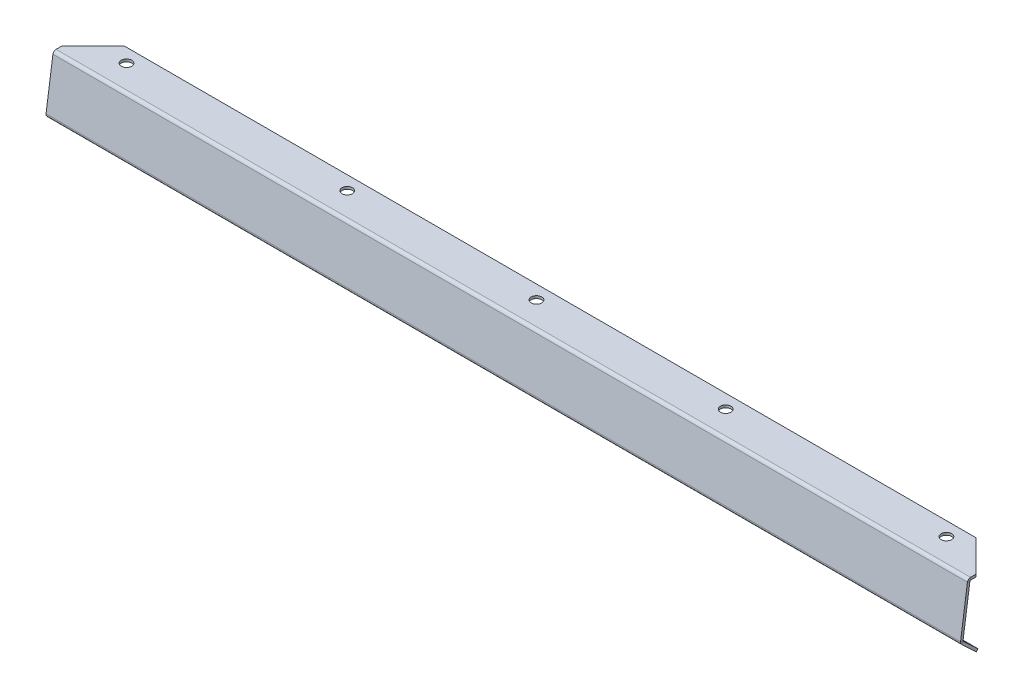
ISO-10303-21;
HEADER;
FILE_DESCRIPTION(('STEP AP214'),'2;1');
FILE_NAME('part.step','',(''),(''),'','','');
FILE_SCHEMA(('AUTOMOTIVE_DESIGN { 1 0 10303 214 1 1 1 1 }'));
ENDSEC;
DATA;
#1=APPLICATION_CONTEXT('core data for automotive mechanical design processes');
#2=APPLICATION_PROTOCOL_DEFINITION('international standard','automotive_design',2000,#1);
#3=PRODUCT_CONTEXT('',#1,'mechanical');
#4=PRODUCT('Part','Part','',(#3));
#5=PRODUCT_RELATED_PRODUCT_CATEGORY('part','',(#4));
#6=PRODUCT_DEFINITION_FORMATION('','',#4);
#7=PRODUCT_DEFINITION_CONTEXT('part definition',#1,'design');
#8=PRODUCT_DEFINITION('design','',#6,#7);
#9=PRODUCT_DEFINITION_SHAPE('','',#8);
#10=(LENGTH_UNIT() NAMED_UNIT(*) SI_UNIT(.MILLI.,.METRE.));
#11=(NAMED_UNIT(*) PLANE_ANGLE_UNIT() SI_UNIT($,.RADIAN.));
#12=(NAMED_UNIT(*) SI_UNIT($,.STERADIAN.) SOLID_ANGLE_UNIT());
#13=UNCERTAINTY_MEASURE_WITH_UNIT(LENGTH_MEASURE(1.E-05),#10,'distance_accuracy_value','');
#14=(GEOMETRIC_REPRESENTATION_CONTEXT(3) GLOBAL_UNCERTAINTY_ASSIGNED_CONTEXT((#13)) GLOBAL_UNIT_ASSIGNED_CONTEXT((#10,
#11,#12)) REPRESENTATION_CONTEXT('',''));
#15=CARTESIAN_POINT('',(0.,0.,0.));
#16=DIRECTION('',(0.,0.,1.));
#17=DIRECTION('',(1.,0.,0.));
#18=AXIS2_PLACEMENT_3D('',#15,#16,#17);
#19=CARTESIAN_POINT('',(-184.15,0.,10.4394001306232));
#20=DIRECTION('',(0.,1.,0.));
#21=DIRECTION('',(0.,0.,1.));
#22=AXIS2_PLACEMENT_3D('',#19,#20,#21);
#23=PLANE('',#22);
#24=CARTESIAN_POINT('',(-76.2,0.,0.));
#25=DIRECTION('',(0.,1.,0.));
#26=DIRECTION('',(0.,0.,-1.));
#27=AXIS2_PLACEMENT_3D('',#24,#25,#26);
#28=CIRCLE('',#27,2.1082);
#29=CARTESIAN_POINT('',(-76.2,0.,-2.1082));
#30=VERTEX_POINT('',#29);
#31=EDGE_CURVE('E248',#30,#30,#28,.T.);
#32=ORIENTED_EDGE('',*,*,#31,.F.);
#33=EDGE_LOOP('',(#32));
#34=FACE_BOUND('',#33,.T.);
#35=CARTESIAN_POINT('',(-165.1,0.,0.));
#36=DIRECTION('',(0.,1.,0.));
#37=DIRECTION('',(0.,0.,-1.));
#38=AXIS2_PLACEMENT_3D('',#35,#36,#37);
#39=CIRCLE('',#38,2.10820000000002);
#40=CARTESIAN_POINT('',(-165.1,0.,-2.10820000000002));
#41=VERTEX_POINT('',#40);
#42=EDGE_CURVE('E238',#41,#41,#39,.T.);
#43=ORIENTED_EDGE('',*,*,#42,.F.);
#44=EDGE_LOOP('',(#43));
#45=FACE_BOUND('',#44,.T.);
#46=CARTESIAN_POINT('',(165.1,0.,0.));
#47=DIRECTION('',(0.,1.,0.));
#48=DIRECTION('',(0.,0.,1.));
#49=AXIS2_PLACEMENT_3D('',#46,#47,#48);
#50=CIRCLE('',#49,2.10820000000002);
#51=CARTESIAN_POINT('',(165.1,0.,2.10820000000002));
#52=VERTEX_POINT('',#51);
#53=EDGE_CURVE('E235',#52,#52,#50,.T.);
#54=ORIENTED_EDGE('',*,*,#53,.F.);
#55=EDGE_LOOP('',(#54));
#56=FACE_BOUND('',#55,.T.);
#57=CARTESIAN_POINT('',(76.2,0.,0.));
#58=DIRECTION('',(0.,1.,0.));
#59=DIRECTION('',(0.,0.,1.));
#60=AXIS2_PLACEMENT_3D('',#57,#58,#59);
#61=CIRCLE('',#60,2.1082);
#62=CARTESIAN_POINT('',(76.2,0.,2.1082));
#63=VERTEX_POINT('',#62);
#64=EDGE_CURVE('E232',#63,#63,#61,.T.);
#65=ORIENTED_EDGE('',*,*,#64,.F.);
#66=EDGE_LOOP('',(#65));
#67=FACE_BOUND('',#66,.T.);
#68=CARTESIAN_POINT('',(0.,0.,0.));
#69=DIRECTION('',(0.,1.,0.));
#70=DIRECTION('',(0.,0.,1.));
#71=AXIS2_PLACEMENT_3D('',#68,#69,#70);
#72=CIRCLE('',#71,2.1082);
#73=CARTESIAN_POINT('',(0.,0.,2.1082));
#74=VERTEX_POINT('',#73);
#75=EDGE_CURVE('E228',#74,#74,#72,.T.);
#76=ORIENTED_EDGE('',*,*,#75,.F.);
#77=EDGE_LOOP('',(#76));
#78=FACE_BOUND('',#77,.T.);
#79=DIRECTION('',(0.,0.,1.));
#80=VECTOR('',#79,1.);
#81=CARTESIAN_POINT('',(184.15,0.,10.4394001306232));
#82=LINE('',#81,#80);
#83=CARTESIAN_POINT('',(184.15,0.,7.13740013062336));
#84=VERTEX_POINT('',#83);
#85=CARTESIAN_POINT('',(184.15,0.,9.33821065404479));
#86=VERTEX_POINT('',#85);
#87=EDGE_CURVE('E159',#84,#86,#82,.T.);
#88=ORIENTED_EDGE('',*,*,#87,.F.);
#89=DIRECTION('',(0.707106781186544,0.,0.707106781186551));
#90=VECTOR('',#89,1.);
#91=CARTESIAN_POINT('',(170.559937335768,0.,-6.45266253360896));
#92=LINE('',#91,#90);
#93=CARTESIAN_POINT('',(171.45,0.,-5.5625998693768));
#94=VERTEX_POINT('',#93);
#95=EDGE_CURVE('E54',#94,#84,#92,.T.);
#96=ORIENTED_EDGE('',*,*,#95,.F.);
#97=DIRECTION('',(1.,0.,0.));
#98=VECTOR('',#97,1.);
#99=CARTESIAN_POINT('',(-184.15,0.,-5.56259986937679));
#100=LINE('',#99,#98);
#101=CARTESIAN_POINT('',(-171.45,0.,-5.56259986937679));
#102=VERTEX_POINT('',#101);
#103=EDGE_CURVE('E191',#102,#94,#100,.T.);
#104=ORIENTED_EDGE('',*,*,#103,.F.);
#105=DIRECTION('',(0.707106781186544,0.,-0.707106781186551));
#106=VECTOR('',#105,1.);
#107=CARTESIAN_POINT('',(-170.559937335768,0.,-6.45266253360896));
#108=LINE('',#107,#106);
#109=CARTESIAN_POINT('',(-184.15,0.,7.13740013062334));
#110=VERTEX_POINT('',#109);
#111=EDGE_CURVE('E436',#110,#102,#108,.T.);
#112=ORIENTED_EDGE('',*,*,#111,.F.);
#113=DIRECTION('',(0.,0.,1.));
#114=VECTOR('',#113,1.);
#115=CARTESIAN_POINT('',(-184.15,0.,10.4394001306232));
#116=LINE('',#115,#114);
#117=CARTESIAN_POINT('',(-184.15,0.,9.33821065404479));
#118=VERTEX_POINT('',#117);
#119=EDGE_CURVE('E273',#110,#118,#116,.T.);
#120=ORIENTED_EDGE('',*,*,#119,.T.);
#121=DIRECTION('',(1.,0.,0.));
#122=VECTOR('',#121,1.);
#123=CARTESIAN_POINT('',(-184.15,0.,9.33821065404479));
#124=LINE('',#123,#122);
#125=EDGE_CURVE('E188',#118,#86,#124,.T.);
#126=ORIENTED_EDGE('',*,*,#125,.T.);
#127=EDGE_LOOP('',(#88,#96,#104,#112,#120,#126));
#128=FACE_BOUND('',#127,.T.);
#129=ADVANCED_FACE('F37',(#34,#45,#56,#67,#78,#128),#23,.T.);
#130=CARTESIAN_POINT('',(-184.15,0.,-5.56259986937679));
#131=DIRECTION('',(0.,0.,1.));
#132=DIRECTION('',(1.,0.,0.));
#133=AXIS2_PLACEMENT_3D('',#130,#131,#132);
#134=PLANE('',#133);
#135=DIRECTION('',(0.,1.,0.));
#136=VECTOR('',#135,1.);
#137=CARTESIAN_POINT('',(171.45,0.,-5.5625998693768));
#138=LINE('',#137,#136);
#139=CARTESIAN_POINT('',(171.45,-1.016,-5.5625998693768));
#140=VERTEX_POINT('',#139);
#141=EDGE_CURVE('E144',#94,#140,#138,.F.);
#142=ORIENTED_EDGE('',*,*,#141,.T.);
#143=DIRECTION('',(1.,0.,0.));
#144=VECTOR('',#143,1.);
#145=CARTESIAN_POINT('',(-184.15,-1.016,-5.56259986937679));
#146=LINE('',#145,#144);
#147=CARTESIAN_POINT('',(-171.45,-1.016,-5.56259986937679));
#148=VERTEX_POINT('',#147);
#149=EDGE_CURVE('E153',#148,#140,#146,.T.);
#150=ORIENTED_EDGE('',*,*,#149,.F.);
#151=DIRECTION('',(0.,-1.,0.));
#152=VECTOR('',#151,1.);
#153=CARTESIAN_POINT('',(-171.45,-1.016,-5.56259986937679));
#154=LINE('',#153,#152);
#155=EDGE_CURVE('E441',#148,#102,#154,.F.);
#156=ORIENTED_EDGE('',*,*,#155,.T.);
#157=ORIENTED_EDGE('',*,*,#103,.T.);
#158=EDGE_LOOP('',(#142,#150,#156,#157));
#159=FACE_BOUND('',#158,.T.);
#160=ADVANCED_FACE('F363',(#159),#134,.F.);
#161=CARTESIAN_POINT('',(-184.15,-1.016,10.4394001306232));
#162=DIRECTION('',(0.,1.,0.));
#163=DIRECTION('',(0.,0.,1.));
#164=AXIS2_PLACEMENT_3D('',#161,#162,#163);
#165=PLANE('',#164);
#166=CARTESIAN_POINT('',(-76.2,-1.016,0.));
#167=DIRECTION('',(0.,1.,0.));
#168=DIRECTION('',(0.,0.,1.));
#169=AXIS2_PLACEMENT_3D('',#166,#167,#168);
#170=CIRCLE('',#169,2.1082);
#171=CARTESIAN_POINT('',(-76.2,-1.016,2.1082));
#172=VERTEX_POINT('',#171);
#173=EDGE_CURVE('E41',#172,#172,#170,.T.);
#174=ORIENTED_EDGE('',*,*,#173,.T.);
#175=EDGE_LOOP('',(#174));
#176=FACE_BOUND('',#175,.T.);
#177=CARTESIAN_POINT('',(-165.1,-1.016,0.));
#178=DIRECTION('',(0.,1.,0.));
#179=DIRECTION('',(0.,0.,1.));
#180=AXIS2_PLACEMENT_3D('',#177,#178,#179);
#181=CIRCLE('',#180,2.10820000000002);
#182=CARTESIAN_POINT('',(-165.1,-1.016,2.10820000000002));
#183=VERTEX_POINT('',#182);
#184=EDGE_CURVE('E236',#183,#183,#181,.T.);
#185=ORIENTED_EDGE('',*,*,#184,.T.);
#186=EDGE_LOOP('',(#185));
#187=FACE_BOUND('',#186,.T.);
#188=CARTESIAN_POINT('',(165.1,-1.016,0.));
#189=DIRECTION('',(0.,1.,0.));
#190=DIRECTION('',(0.,0.,1.));
#191=AXIS2_PLACEMENT_3D('',#188,#189,#190);
#192=CIRCLE('',#191,2.10820000000002);
#193=CARTESIAN_POINT('',(165.1,-1.016,2.10820000000002));
#194=VERTEX_POINT('',#193);
#195=EDGE_CURVE('E233',#194,#194,#192,.T.);
#196=ORIENTED_EDGE('',*,*,#195,.T.);
#197=EDGE_LOOP('',(#196));
#198=FACE_BOUND('',#197,.T.);
#199=CARTESIAN_POINT('',(76.2,-1.016,0.));
#200=DIRECTION('',(0.,1.,0.));
#201=DIRECTION('',(0.,0.,1.));
#202=AXIS2_PLACEMENT_3D('',#199,#200,#201);
#203=CIRCLE('',#202,2.1082);
#204=CARTESIAN_POINT('',(76.2,-1.016,2.1082));
#205=VERTEX_POINT('',#204);
#206=EDGE_CURVE('E229',#205,#205,#203,.T.);
#207=ORIENTED_EDGE('',*,*,#206,.T.);
#208=EDGE_LOOP('',(#207));
#209=FACE_BOUND('',#208,.T.);
#210=CARTESIAN_POINT('',(0.,-1.016,0.));
#211=DIRECTION('',(0.,1.,0.));
#212=DIRECTION('',(0.,0.,1.));
#213=AXIS2_PLACEMENT_3D('',#210,#211,#212);
#214=CIRCLE('',#213,2.1082);
#215=CARTESIAN_POINT('',(0.,-1.016,2.1082));
#216=VERTEX_POINT('',#215);
#217=EDGE_CURVE('E224',#216,#216,#214,.T.);
#218=ORIENTED_EDGE('',*,*,#217,.T.);
#219=EDGE_LOOP('',(#218));
#220=FACE_BOUND('',#219,.T.);
#221=DIRECTION('',(0.707106781186544,0.,0.707106781186551));
#222=VECTOR('',#221,1.);
#223=CARTESIAN_POINT('',(170.559937335768,-1.016,-6.45266253360896));
#224=LINE('',#223,#222);
#225=CARTESIAN_POINT('',(184.15,-1.016,7.13740013062335));
#226=VERTEX_POINT('',#225);
#227=EDGE_CURVE('E139',#140,#226,#224,.T.);
#228=ORIENTED_EDGE('',*,*,#227,.T.);
#229=DIRECTION('',(0.,0.,-1.));
#230=VECTOR('',#229,1.);
#231=CARTESIAN_POINT('',(184.15,-1.016,10.4394001306232));
#232=LINE('',#231,#230);
#233=CARTESIAN_POINT('',(184.15,-1.016,9.33821065404479));
#234=VERTEX_POINT('',#233);
#235=EDGE_CURVE('E150',#226,#234,#232,.F.);
#236=ORIENTED_EDGE('',*,*,#235,.T.);
#237=DIRECTION('',(1.,0.,0.));
#238=VECTOR('',#237,1.);
#239=CARTESIAN_POINT('',(-184.15,-1.016,9.33821065404479));
#240=LINE('',#239,#238);
#241=CARTESIAN_POINT('',(-184.15,-1.016,9.33821065404479));
#242=VERTEX_POINT('',#241);
#243=EDGE_CURVE('E195',#242,#234,#240,.T.);
#244=ORIENTED_EDGE('',*,*,#243,.F.);
#245=DIRECTION('',(0.,0.,-1.));
#246=VECTOR('',#245,1.);
#247=CARTESIAN_POINT('',(-184.15,-1.016,10.4394001306232));
#248=LINE('',#247,#246);
#249=CARTESIAN_POINT('',(-184.15,-1.016,7.13740013062334));
#250=VERTEX_POINT('',#249);
#251=EDGE_CURVE('E271',#250,#242,#248,.F.);
#252=ORIENTED_EDGE('',*,*,#251,.F.);
#253=DIRECTION('',(0.707106781186544,0.,-0.707106781186551));
#254=VECTOR('',#253,1.);
#255=CARTESIAN_POINT('',(-170.559937335768,-1.016,-6.45266253360896));
#256=LINE('',#255,#254);
#257=EDGE_CURVE('E62',#250,#148,#256,.T.);
#258=ORIENTED_EDGE('',*,*,#257,.T.);
#259=ORIENTED_EDGE('',*,*,#149,.T.);
#260=EDGE_LOOP('',(#228,#236,#244,#252,#258,#259));
#261=FACE_BOUND('',#260,.T.);
#262=ADVANCED_FACE('F148',(#176,#187,#198,#209,#220,#261),#165,.F.);
#263=CARTESIAN_POINT('',(184.15,-1.23401666822171,9.58964891651519));
#264=DIRECTION('',(1.,0.,0.));
#265=DIRECTION('',(0.,0.,-1.));
#266=AXIS2_PLACEMENT_3D('',#263,#264,#265);
#267=PLANE('',#266);
#268=ORIENTED_EDGE('',*,*,#235,.F.);
#269=DIRECTION('',(0.,1.,0.));
#270=VECTOR('',#269,1.);
#271=CARTESIAN_POINT('',(184.15,0.,7.13740013062335));
#272=LINE('',#271,#270);
#273=EDGE_CURVE('E136',#84,#226,#272,.F.);
#274=ORIENTED_EDGE('',*,*,#273,.F.);
#275=ORIENTED_EDGE('',*,*,#87,.T.);
#276=DIRECTION('',(0.,-1.,0.));
#277=VECTOR('',#276,1.);
#278=CARTESIAN_POINT('',(184.15,0.,9.33821065404479));
#279=LINE('',#278,#277);
#280=EDGE_CURVE('E157',#86,#234,#279,.T.);
#281=ORIENTED_EDGE('',*,*,#280,.T.);
#282=EDGE_LOOP('',(#268,#274,#275,#281));
#283=FACE_BOUND('',#282,.T.);
#284=ADVANCED_FACE('F155',(#283),#267,.T.);
#285=CARTESIAN_POINT('',(-184.15,-20.6462783329546,12.1111500031837));
#286=DIRECTION('',(1.,0.,0.));
#287=DIRECTION('',(0.,0.,-1.));
#288=AXIS2_PLACEMENT_3D('',#285,#286,#287);
#289=PLANE('',#288);
#290=DIRECTION('',(0.,-1.,0.));
#291=VECTOR('',#290,1.);
#292=CARTESIAN_POINT('',(-184.15,-1.016,7.13740013062334));
#293=LINE('',#292,#291);
#294=EDGE_CURVE('E438',#250,#110,#293,.F.);
#295=ORIENTED_EDGE('',*,*,#294,.F.);
#296=ORIENTED_EDGE('',*,*,#251,.T.);
#297=DIRECTION('',(0.,1.,0.));
#298=VECTOR('',#297,1.);
#299=CARTESIAN_POINT('',(-184.15,-1.016,9.33821065404479));
#300=LINE('',#299,#298);
#301=EDGE_CURVE('E46',#242,#118,#300,.T.);
#302=ORIENTED_EDGE('',*,*,#301,.T.);
#303=ORIENTED_EDGE('',*,*,#119,.F.);
#304=EDGE_LOOP('',(#295,#296,#302,#303));
#305=FACE_BOUND('',#304,.T.);
#306=ADVANCED_FACE('F399',(#305),#289,.F.);
#307=CARTESIAN_POINT('',(-184.15,-1.09008334110853,10.5954019663968));
#308=DIRECTION('',(-1.,0.,0.));
#309=DIRECTION('',(0.,0.,1.));
#310=AXIS2_PLACEMENT_3D('',#307,#308,#309);
#311=PLANE('',#310);
#312=DIRECTION('',(0.,-0.141666660544467,-0.989914419174798));
#313=VECTOR('',#312,1.);
#314=CARTESIAN_POINT('',(-184.15,-1.09008334110853,10.5954019663968));
#315=LINE('',#314,#313);
#316=CARTESIAN_POINT('',(-184.15,-1.09008334110853,10.5954019663968));
#317=VERTEX_POINT('',#316);
#318=CARTESIAN_POINT('',(-184.15,-1.23401666822171,9.58964891651519));
#319=VERTEX_POINT('',#318);
#320=EDGE_CURVE('E11',#317,#319,#315,.T.);
#321=ORIENTED_EDGE('',*,*,#320,.F.);
#322=CARTESIAN_POINT('',(-184.15,-1.27,9.33821065404479));
#323=DIRECTION('',(-1.,0.,0.));
#324=DIRECTION('',(0.,0.,1.));
#325=AXIS2_PLACEMENT_3D('',#322,#323,#324);
#326=CIRCLE('',#325,1.27);
#327=EDGE_CURVE('E275',#118,#317,#326,.F.);
#328=ORIENTED_EDGE('',*,*,#327,.F.);
#329=ORIENTED_EDGE('',*,*,#301,.F.);
#330=CARTESIAN_POINT('',(-184.15,-1.27,9.33821065404479));
#331=DIRECTION('',(1.,0.,0.));
#332=DIRECTION('',(0.,0.,-1.));
#333=AXIS2_PLACEMENT_3D('',#330,#331,#332);
#334=CIRCLE('',#333,0.254);
#335=EDGE_CURVE('E268',#242,#319,#334,.T.);
#336=ORIENTED_EDGE('',*,*,#335,.T.);
#337=EDGE_LOOP('',(#321,#328,#329,#336));
#338=FACE_BOUND('',#337,.T.);
#339=ADVANCED_FACE('F39',(#338),#311,.T.);
#340=CARTESIAN_POINT('',(-184.15,-1.016,9.33821065404479));
#341=DIRECTION('',(-1.,0.,0.));
#342=DIRECTION('',(0.,0.,1.));
#343=AXIS2_PLACEMENT_3D('',#340,#341,#342);
#344=PLANE('',#343);
#345=DIRECTION('',(0.,-0.989914419174799,0.141666660544467));
#346=VECTOR('',#345,1.);
#347=CARTESIAN_POINT('',(-184.15,0.,10.4394001306232));
#348=LINE('',#347,#346);
#349=CARTESIAN_POINT('',(-184.15,-20.4663616740631,13.3683413155357));
#350=VERTEX_POINT('',#349);
#351=EDGE_CURVE('E278',#317,#350,#348,.T.);
#352=ORIENTED_EDGE('',*,*,#351,.F.);
#353=ORIENTED_EDGE('',*,*,#320,.T.);
#354=DIRECTION('',(0.,-0.989914419174799,0.141666660544467));
#355=VECTOR('',#354,1.);
#356=CARTESIAN_POINT('',(-184.15,-0.143933327113178,9.43364708074162));
#357=LINE('',#356,#355);
#358=CARTESIAN_POINT('',(-184.15,-20.6102950011763,12.3625882656541));
#359=VERTEX_POINT('',#358);
#360=EDGE_CURVE('E265',#319,#359,#357,.T.);
#361=ORIENTED_EDGE('',*,*,#360,.T.);
#362=DIRECTION('',(0.,0.141666660544464,0.989914419174799));
#363=VECTOR('',#362,1.);
#364=CARTESIAN_POINT('',(-184.15,-20.6102950011763,12.3625882656541));
#365=LINE('',#364,#363);
#366=EDGE_CURVE('E215',#359,#350,#365,.T.);
#367=ORIENTED_EDGE('',*,*,#366,.T.);
#368=EDGE_LOOP('',(#352,#353,#361,#367));
#369=FACE_BOUND('',#368,.T.);
#370=ADVANCED_FACE('F335',(#369),#344,.T.);
#371=CARTESIAN_POINT('',(184.15,0.,9.33821065404479));
#372=DIRECTION('',(1.,0.,0.));
#373=DIRECTION('',(0.,0.,-1.));
#374=AXIS2_PLACEMENT_3D('',#371,#372,#373);
#375=PLANE('',#374);
#376=ORIENTED_EDGE('',*,*,#280,.F.);
#377=CARTESIAN_POINT('',(184.15,-1.27,9.33821065404479));
#378=DIRECTION('',(-1.,0.,0.));
#379=DIRECTION('',(0.,0.,1.));
#380=AXIS2_PLACEMENT_3D('',#377,#378,#379);
#381=CIRCLE('',#380,1.27);
#382=CARTESIAN_POINT('',(184.15,-1.09008334110853,10.5954019663968));
#383=VERTEX_POINT('',#382);
#384=EDGE_CURVE('E162',#86,#383,#381,.F.);
#385=ORIENTED_EDGE('',*,*,#384,.T.);
#386=DIRECTION('',(0.,0.141666660544467,0.989914419174798));
#387=VECTOR('',#386,1.);
#388=CARTESIAN_POINT('',(184.15,-1.23401666822171,9.58964891651519));
#389=LINE('',#388,#387);
#390=CARTESIAN_POINT('',(184.15,-1.23401666822171,9.58964891651519));
#391=VERTEX_POINT('',#390);
#392=EDGE_CURVE('E219',#391,#383,#389,.T.);
#393=ORIENTED_EDGE('',*,*,#392,.F.);
#394=CARTESIAN_POINT('',(184.15,-1.27,9.33821065404479));
#395=DIRECTION('',(1.,0.,0.));
#396=DIRECTION('',(0.,0.,-1.));
#397=AXIS2_PLACEMENT_3D('',#394,#395,#396);
#398=CIRCLE('',#397,0.254);
#399=EDGE_CURVE('E160',#234,#391,#398,.T.);
#400=ORIENTED_EDGE('',*,*,#399,.F.);
#401=EDGE_LOOP('',(#376,#385,#393,#400));
#402=FACE_BOUND('',#401,.T.);
#403=ADVANCED_FACE('F345',(#402),#375,.T.);
#404=CARTESIAN_POINT('',(-184.15,-21.572913210483,12.9796244148666));
#405=DIRECTION('',(-1.,0.,0.));
#406=DIRECTION('',(0.,0.,1.));
#407=AXIS2_PLACEMENT_3D('',#404,#405,#406);
#408=PLANE('',#407);
#409=DIRECTION('',(0.,0.729633761833339,-0.68383811943539));
#410=VECTOR('',#409,1.);
#411=CARTESIAN_POINT('',(-184.15,-21.572913210483,12.9796244148666));
#412=LINE('',#411,#410);
#413=CARTESIAN_POINT('',(-184.15,-21.572913210483,12.9796244148666));
#414=VERTEX_POINT('',#413);
#415=CARTESIAN_POINT('',(-184.15,-20.8316053084603,12.2848448855203));
#416=VERTEX_POINT('',#415);
#417=EDGE_CURVE('E217',#414,#416,#412,.T.);
#418=ORIENTED_EDGE('',*,*,#417,.F.);
#419=CARTESIAN_POINT('',(-184.15,-20.6462783329546,12.1111500031837));
#420=DIRECTION('',(-1.,0.,0.));
#421=DIRECTION('',(0.,0.,1.));
#422=AXIS2_PLACEMENT_3D('',#419,#420,#421);
#423=CIRCLE('',#422,1.27);
#424=EDGE_CURVE('E211',#350,#414,#423,.F.);
#425=ORIENTED_EDGE('',*,*,#424,.F.);
#426=ORIENTED_EDGE('',*,*,#366,.F.);
#427=CARTESIAN_POINT('',(-184.15,-20.6462783329546,12.1111500031837));
#428=DIRECTION('',(1.,0.,0.));
#429=DIRECTION('',(0.,0.,-1.));
#430=AXIS2_PLACEMENT_3D('',#427,#428,#429);
#431=CIRCLE('',#430,0.254);
#432=EDGE_CURVE('E262',#359,#416,#431,.T.);
#433=ORIENTED_EDGE('',*,*,#432,.T.);
#434=EDGE_LOOP('',(#418,#425,#426,#433));
#435=FACE_BOUND('',#434,.T.);
#436=ADVANCED_FACE('F332',(#435),#408,.T.);
#437=CARTESIAN_POINT('',(-184.15,-20.6102950011763,12.3625882656541));
#438=DIRECTION('',(-1.,0.,0.));
#439=DIRECTION('',(0.,0.,1.));
#440=AXIS2_PLACEMENT_3D('',#437,#438,#439);
#441=PLANE('',#440);
#442=DIRECTION('',(0.,-0.683838119435389,-0.729633761833339));
#443=VECTOR('',#442,1.);
#444=CARTESIAN_POINT('',(-184.15,-21.1208140475135,13.462));
#445=LINE('',#444,#443);
#446=CARTESIAN_POINT('',(-184.15,-27.1480264645931,7.03115394995328));
#447=VERTEX_POINT('',#446);
#448=EDGE_CURVE('E177',#414,#447,#445,.T.);
#449=ORIENTED_EDGE('',*,*,#448,.F.);
#450=ORIENTED_EDGE('',*,*,#417,.T.);
#451=DIRECTION('',(0.,-0.683838119435389,-0.729633761833339));
#452=VECTOR('',#451,1.);
#453=CARTESIAN_POINT('',(-184.15,-20.3795061454908,12.7672204706536));
#454=LINE('',#453,#452);
#455=CARTESIAN_POINT('',(-184.15,-26.4067185625705,6.33637442060692));
#456=VERTEX_POINT('',#455);
#457=EDGE_CURVE('E260',#416,#456,#454,.T.);
#458=ORIENTED_EDGE('',*,*,#457,.T.);
#459=DIRECTION('',(0.,-0.729633761833339,0.68383811943539));
#460=VECTOR('',#459,1.);
#461=CARTESIAN_POINT('',(-184.15,-26.4067185625705,6.33637442060692));
#462=LINE('',#461,#460);
#463=EDGE_CURVE('E258',#456,#447,#462,.T.);
#464=ORIENTED_EDGE('',*,*,#463,.T.);
#465=EDGE_LOOP('',(#449,#450,#458,#464));
#466=FACE_BOUND('',#465,.T.);
#467=ADVANCED_FACE('F330',(#466),#441,.T.);
#468=CARTESIAN_POINT('',(184.15,-20.4663616740631,13.3683413155357));
#469=DIRECTION('',(1.,0.,0.));
#470=DIRECTION('',(0.,0.,-1.));
#471=AXIS2_PLACEMENT_3D('',#468,#469,#470);
#472=PLANE('',#471);
#473=DIRECTION('',(0.,-0.141666660544464,-0.989914419174799));
#474=VECTOR('',#473,1.);
#475=CARTESIAN_POINT('',(184.15,-20.4663616740631,13.3683413155357));
#476=LINE('',#475,#474);
#477=CARTESIAN_POINT('',(184.15,-20.4663616740631,13.3683413155357));
#478=VERTEX_POINT('',#477);
#479=CARTESIAN_POINT('',(184.15,-20.6102950011763,12.3625882656541));
#480=VERTEX_POINT('',#479);
#481=EDGE_CURVE('E213',#478,#480,#476,.T.);
#482=ORIENTED_EDGE('',*,*,#481,.F.);
#483=CARTESIAN_POINT('',(184.15,-20.6462783329546,12.1111500031837));
#484=DIRECTION('',(-1.,0.,0.));
#485=DIRECTION('',(0.,0.,1.));
#486=AXIS2_PLACEMENT_3D('',#483,#484,#485);
#487=CIRCLE('',#486,1.27);
#488=CARTESIAN_POINT('',(184.15,-21.572913210483,12.9796244148666));
#489=VERTEX_POINT('',#488);
#490=EDGE_CURVE('E174',#478,#489,#487,.F.);
#491=ORIENTED_EDGE('',*,*,#490,.T.);
#492=DIRECTION('',(0.,-0.729633761833339,0.68383811943539));
#493=VECTOR('',#492,1.);
#494=CARTESIAN_POINT('',(184.15,-20.8316053084603,12.2848448855203));
#495=LINE('',#494,#493);
#496=CARTESIAN_POINT('',(184.15,-20.8316053084603,12.2848448855203));
#497=VERTEX_POINT('',#496);
#498=EDGE_CURVE('E181',#497,#489,#495,.T.);
#499=ORIENTED_EDGE('',*,*,#498,.F.);
#500=CARTESIAN_POINT('',(184.15,-20.6462783329546,12.1111500031837));
#501=DIRECTION('',(1.,0.,0.));
#502=DIRECTION('',(0.,0.,-1.));
#503=AXIS2_PLACEMENT_3D('',#500,#501,#502);
#504=CIRCLE('',#503,0.254);
#505=EDGE_CURVE('E290',#480,#497,#504,.T.);
#506=ORIENTED_EDGE('',*,*,#505,.F.);
#507=EDGE_LOOP('',(#482,#491,#499,#506));
#508=FACE_BOUND('',#507,.T.);
#509=ADVANCED_FACE('F306',(#508),#472,.T.);
#510=CARTESIAN_POINT('',(184.15,-20.8316053084603,12.2848448855203));
#511=DIRECTION('',(1.,0.,0.));
#512=DIRECTION('',(0.,0.,-1.));
#513=AXIS2_PLACEMENT_3D('',#510,#511,#512);
#514=PLANE('',#513);
#515=DIRECTION('',(0.,-0.989914419174799,0.141666660544467));
#516=VECTOR('',#515,1.);
#517=CARTESIAN_POINT('',(184.15,0.,10.4394001306232));
#518=LINE('',#517,#516);
#519=EDGE_CURVE('E171',#383,#478,#518,.T.);
#520=ORIENTED_EDGE('',*,*,#519,.T.);
#521=ORIENTED_EDGE('',*,*,#481,.T.);
#522=DIRECTION('',(0.,-0.989914419174799,0.141666660544467));
#523=VECTOR('',#522,1.);
#524=CARTESIAN_POINT('',(184.15,-0.143933327113178,9.43364708074162));
#525=LINE('',#524,#523);
#526=EDGE_CURVE('E165',#391,#480,#525,.T.);
#527=ORIENTED_EDGE('',*,*,#526,.F.);
#528=ORIENTED_EDGE('',*,*,#392,.T.);
#529=EDGE_LOOP('',(#520,#521,#527,#528));
#530=FACE_BOUND('',#529,.T.);
#531=ADVANCED_FACE('F347',(#530),#514,.T.);
#532=CARTESIAN_POINT('',(-184.15,-21.1208140475135,13.462));
#533=DIRECTION('',(0.,-0.729633761833339,0.683838119435389));
#534=DIRECTION('',(0.,-0.683838119435389,-0.72963376183334));
#535=AXIS2_PLACEMENT_3D('',#532,#533,#534);
#536=PLANE('',#535);
#537=DIRECTION('',(0.,-0.683838119435389,-0.729633761833339));
#538=VECTOR('',#537,1.);
#539=CARTESIAN_POINT('',(184.15,-21.1208140475135,13.462));
#540=LINE('',#539,#538);
#541=CARTESIAN_POINT('',(184.15,-27.1480264645931,7.03115394995328));
#542=VERTEX_POINT('',#541);
#543=EDGE_CURVE('E227',#489,#542,#540,.T.);
#544=ORIENTED_EDGE('',*,*,#543,.F.);
#545=DIRECTION('',(1.,0.,0.));
#546=VECTOR('',#545,1.);
#547=CARTESIAN_POINT('',(-184.15,-21.572913210483,12.9796244148666));
#548=LINE('',#547,#546);
#549=EDGE_CURVE('E178',#414,#489,#548,.T.);
#550=ORIENTED_EDGE('',*,*,#549,.F.);
#551=ORIENTED_EDGE('',*,*,#448,.T.);
#552=DIRECTION('',(1.,0.,0.));
#553=VECTOR('',#552,1.);
#554=CARTESIAN_POINT('',(-184.15,-27.1480264645931,7.03115394995328));
#555=LINE('',#554,#553);
#556=EDGE_CURVE('E209',#447,#542,#555,.T.);
#557=ORIENTED_EDGE('',*,*,#556,.T.);
#558=EDGE_LOOP('',(#544,#550,#551,#557));
#559=FACE_BOUND('',#558,.T.);
#560=ADVANCED_FACE('F320',(#559),#536,.T.);
#561=CARTESIAN_POINT('',(-184.15,-20.6462783329546,12.1111500031837));
#562=DIRECTION('',(1.,0.,0.));
#563=DIRECTION('',(0.,0.,-1.));
#564=AXIS2_PLACEMENT_3D('',#561,#562,#563);
#565=CYLINDRICAL_SURFACE('',#564,1.27);
#566=ORIENTED_EDGE('',*,*,#490,.F.);
#567=DIRECTION('',(1.,0.,0.));
#568=VECTOR('',#567,1.);
#569=CARTESIAN_POINT('',(-184.15,-20.4663616740631,13.3683413155357));
#570=LINE('',#569,#568);
#571=EDGE_CURVE('E182',#350,#478,#570,.T.);
#572=ORIENTED_EDGE('',*,*,#571,.F.);
#573=ORIENTED_EDGE('',*,*,#424,.T.);
#574=ORIENTED_EDGE('',*,*,#549,.T.);
#575=EDGE_LOOP('',(#566,#572,#573,#574));
#576=FACE_BOUND('',#575,.T.);
#577=ADVANCED_FACE('F315',(#576),#565,.T.);
#578=CARTESIAN_POINT('',(-184.15,0.,10.4394001306232));
#579=DIRECTION('',(0.,0.141666660544467,0.989914419174798));
#580=DIRECTION('',(0.,-0.989914419174799,0.141666660544467));
#581=AXIS2_PLACEMENT_3D('',#578,#579,#580);
#582=PLANE('',#581);
#583=ORIENTED_EDGE('',*,*,#519,.F.);
#584=DIRECTION('',(1.,0.,0.));
#585=VECTOR('',#584,1.);
#586=CARTESIAN_POINT('',(-184.15,-1.09008334110853,10.5954019663968));
#587=LINE('',#586,#585);
#588=EDGE_CURVE('E185',#317,#383,#587,.T.);
#589=ORIENTED_EDGE('',*,*,#588,.F.);
#590=ORIENTED_EDGE('',*,*,#351,.T.);
#591=ORIENTED_EDGE('',*,*,#571,.T.);
#592=EDGE_LOOP('',(#583,#589,#590,#591));
#593=FACE_BOUND('',#592,.T.);
#594=ADVANCED_FACE('F353',(#593),#582,.T.);
#595=CARTESIAN_POINT('',(-184.15,-1.27,9.33821065404479));
#596=DIRECTION('',(1.,0.,0.));
#597=DIRECTION('',(0.,0.,-1.));
#598=AXIS2_PLACEMENT_3D('',#595,#596,#597);
#599=CYLINDRICAL_SURFACE('',#598,1.27);
#600=ORIENTED_EDGE('',*,*,#384,.F.);
#601=ORIENTED_EDGE('',*,*,#125,.F.);
#602=ORIENTED_EDGE('',*,*,#327,.T.);
#603=ORIENTED_EDGE('',*,*,#588,.T.);
#604=EDGE_LOOP('',(#600,#601,#602,#603));
#605=FACE_BOUND('',#604,.T.);
#606=ADVANCED_FACE('F350',(#605),#599,.T.);
#607=CARTESIAN_POINT('',(-184.15,-1.27,9.33821065404479));
#608=DIRECTION('',(1.,0.,0.));
#609=DIRECTION('',(0.,0.,-1.));
#610=AXIS2_PLACEMENT_3D('',#607,#608,#609);
#611=CYLINDRICAL_SURFACE('',#610,0.254);
#612=ORIENTED_EDGE('',*,*,#399,.T.);
#613=DIRECTION('',(1.,0.,0.));
#614=VECTOR('',#613,1.);
#615=CARTESIAN_POINT('',(-184.15,-1.23401666822171,9.58964891651519));
#616=LINE('',#615,#614);
#617=EDGE_CURVE('E197',#319,#391,#616,.T.);
#618=ORIENTED_EDGE('',*,*,#617,.F.);
#619=ORIENTED_EDGE('',*,*,#335,.F.);
#620=ORIENTED_EDGE('',*,*,#243,.T.);
#621=EDGE_LOOP('',(#612,#618,#619,#620));
#622=FACE_BOUND('',#621,.T.);
#623=ADVANCED_FACE('F342',(#622),#611,.F.);
#624=CARTESIAN_POINT('',(-184.15,-0.143933327113178,9.43364708074162));
#625=DIRECTION('',(0.,0.141666660544467,0.989914419174798));
#626=DIRECTION('',(0.,-0.989914419174799,0.141666660544467));
#627=AXIS2_PLACEMENT_3D('',#624,#625,#626);
#628=PLANE('',#627);
#629=ORIENTED_EDGE('',*,*,#526,.T.);
#630=DIRECTION('',(1.,0.,0.));
#631=VECTOR('',#630,1.);
#632=CARTESIAN_POINT('',(-184.15,-20.6102950011763,12.3625882656541));
#633=LINE('',#632,#631);
#634=EDGE_CURVE('E200',#359,#480,#633,.T.);
#635=ORIENTED_EDGE('',*,*,#634,.F.);
#636=ORIENTED_EDGE('',*,*,#360,.F.);
#637=ORIENTED_EDGE('',*,*,#617,.T.);
#638=EDGE_LOOP('',(#629,#635,#636,#637));
#639=FACE_BOUND('',#638,.T.);
#640=ADVANCED_FACE('F296',(#639),#628,.F.);
#641=CARTESIAN_POINT('',(-184.15,-20.6462783329546,12.1111500031837));
#642=DIRECTION('',(1.,0.,0.));
#643=DIRECTION('',(0.,0.,-1.));
#644=AXIS2_PLACEMENT_3D('',#641,#642,#643);
#645=CYLINDRICAL_SURFACE('',#644,0.254);
#646=ORIENTED_EDGE('',*,*,#505,.T.);
#647=DIRECTION('',(1.,0.,0.));
#648=VECTOR('',#647,1.);
#649=CARTESIAN_POINT('',(-184.15,-20.8316053084603,12.2848448855203));
#650=LINE('',#649,#648);
#651=EDGE_CURVE('E203',#416,#497,#650,.T.);
#652=ORIENTED_EDGE('',*,*,#651,.F.);
#653=ORIENTED_EDGE('',*,*,#432,.F.);
#654=ORIENTED_EDGE('',*,*,#634,.T.);
#655=EDGE_LOOP('',(#646,#652,#653,#654));
#656=FACE_BOUND('',#655,.T.);
#657=ADVANCED_FACE('F303',(#656),#645,.F.);
#658=CARTESIAN_POINT('',(-184.15,-20.3795061454908,12.7672204706536));
#659=DIRECTION('',(0.,-0.729633761833339,0.683838119435389));
#660=DIRECTION('',(0.,-0.683838119435389,-0.729633761833339));
#661=AXIS2_PLACEMENT_3D('',#658,#659,#660);
#662=PLANE('',#661);
#663=DIRECTION('',(0.,-0.683838119435389,-0.729633761833339));
#664=VECTOR('',#663,1.);
#665=CARTESIAN_POINT('',(184.15,-20.3795061454908,12.7672204706536));
#666=LINE('',#665,#664);
#667=CARTESIAN_POINT('',(184.15,-26.4067185625705,6.33637442060692));
#668=VERTEX_POINT('',#667);
#669=EDGE_CURVE('E288',#497,#668,#666,.T.);
#670=ORIENTED_EDGE('',*,*,#669,.T.);
#671=DIRECTION('',(1.,0.,0.));
#672=VECTOR('',#671,1.);
#673=CARTESIAN_POINT('',(-184.15,-26.4067185625705,6.33637442060692));
#674=LINE('',#673,#672);
#675=EDGE_CURVE('E206',#456,#668,#674,.T.);
#676=ORIENTED_EDGE('',*,*,#675,.F.);
#677=ORIENTED_EDGE('',*,*,#457,.F.);
#678=ORIENTED_EDGE('',*,*,#651,.T.);
#679=EDGE_LOOP('',(#670,#676,#677,#678));
#680=FACE_BOUND('',#679,.T.);
#681=ADVANCED_FACE('F328',(#680),#662,.F.);
#682=CARTESIAN_POINT('',(-184.15,-26.4067185625705,6.33637442060692));
#683=DIRECTION('',(0.,0.68383811943539,0.729633761833339));
#684=DIRECTION('',(0.,-0.729633761833339,0.68383811943539));
#685=AXIS2_PLACEMENT_3D('',#682,#683,#684);
#686=PLANE('',#685);
#687=DIRECTION('',(0.,-0.729633761833339,0.68383811943539));
#688=VECTOR('',#687,1.);
#689=CARTESIAN_POINT('',(184.15,-26.4067185625705,6.33637442060692));
#690=LINE('',#689,#688);
#691=EDGE_CURVE('E285',#668,#542,#690,.T.);
#692=ORIENTED_EDGE('',*,*,#691,.T.);
#693=ORIENTED_EDGE('',*,*,#556,.F.);
#694=ORIENTED_EDGE('',*,*,#463,.F.);
#695=ORIENTED_EDGE('',*,*,#675,.T.);
#696=EDGE_LOOP('',(#692,#693,#694,#695));
#697=FACE_BOUND('',#696,.T.);
#698=ADVANCED_FACE('F324',(#697),#686,.F.);
#699=CARTESIAN_POINT('',(184.15,-20.6462783329546,12.1111500031837));
#700=DIRECTION('',(1.,0.,0.));
#701=DIRECTION('',(0.,0.,-1.));
#702=AXIS2_PLACEMENT_3D('',#699,#700,#701);
#703=PLANE('',#702);
#704=ORIENTED_EDGE('',*,*,#543,.T.);
#705=ORIENTED_EDGE('',*,*,#691,.F.);
#706=ORIENTED_EDGE('',*,*,#669,.F.);
#707=ORIENTED_EDGE('',*,*,#498,.T.);
#708=EDGE_LOOP('',(#704,#705,#706,#707));
#709=FACE_BOUND('',#708,.T.);
#710=ADVANCED_FACE('F310',(#709),#703,.T.);
#711=CARTESIAN_POINT('',(0.,-27.1480264645931,0.));
#712=DIRECTION('',(0.,1.,0.));
#713=DIRECTION('',(0.,0.,1.));
#714=AXIS2_PLACEMENT_3D('',#711,#712,#713);
#715=CYLINDRICAL_SURFACE('',#714,2.1082);
#716=ORIENTED_EDGE('',*,*,#75,.T.);
#717=EDGE_LOOP('',(#716));
#718=FACE_BOUND('',#717,.T.);
#719=ORIENTED_EDGE('',*,*,#217,.F.);
#720=EDGE_LOOP('',(#719));
#721=FACE_BOUND('',#720,.T.);
#722=ADVANCED_FACE('F414',(#718,#721),#715,.F.);
#723=CARTESIAN_POINT('',(76.2,-27.1480264645931,0.));
#724=DIRECTION('',(0.,1.,0.));
#725=DIRECTION('',(0.,0.,1.));
#726=AXIS2_PLACEMENT_3D('',#723,#724,#725);
#727=CYLINDRICAL_SURFACE('',#726,2.1082);
#728=ORIENTED_EDGE('',*,*,#64,.T.);
#729=EDGE_LOOP('',(#728));
#730=FACE_BOUND('',#729,.T.);
#731=ORIENTED_EDGE('',*,*,#206,.F.);
#732=EDGE_LOOP('',(#731));
#733=FACE_BOUND('',#732,.T.);
#734=ADVANCED_FACE('F420',(#730,#733),#727,.F.);
#735=CARTESIAN_POINT('',(165.1,-27.1480264645931,0.));
#736=DIRECTION('',(0.,1.,0.));
#737=DIRECTION('',(0.,0.,1.));
#738=AXIS2_PLACEMENT_3D('',#735,#736,#737);
#739=CYLINDRICAL_SURFACE('',#738,2.10820000000002);
#740=ORIENTED_EDGE('',*,*,#53,.T.);
#741=EDGE_LOOP('',(#740));
#742=FACE_BOUND('',#741,.T.);
#743=ORIENTED_EDGE('',*,*,#195,.F.);
#744=EDGE_LOOP('',(#743));
#745=FACE_BOUND('',#744,.T.);
#746=ADVANCED_FACE('F425',(#742,#745),#739,.F.);
#747=CARTESIAN_POINT('',(-165.1,-27.1480264645931,0.));
#748=DIRECTION('',(0.,1.,0.));
#749=DIRECTION('',(0.,0.,1.));
#750=AXIS2_PLACEMENT_3D('',#747,#748,#749);
#751=CYLINDRICAL_SURFACE('',#750,2.10820000000002);
#752=ORIENTED_EDGE('',*,*,#42,.T.);
#753=EDGE_LOOP('',(#752));
#754=FACE_BOUND('',#753,.T.);
#755=ORIENTED_EDGE('',*,*,#184,.F.);
#756=EDGE_LOOP('',(#755));
#757=FACE_BOUND('',#756,.T.);
#758=ADVANCED_FACE('F455',(#754,#757),#751,.F.);
#759=CARTESIAN_POINT('',(-76.2,-27.1480264645931,0.));
#760=DIRECTION('',(0.,1.,0.));
#761=DIRECTION('',(0.,0.,1.));
#762=AXIS2_PLACEMENT_3D('',#759,#760,#761);
#763=CYLINDRICAL_SURFACE('',#762,2.1082);
#764=ORIENTED_EDGE('',*,*,#31,.T.);
#765=EDGE_LOOP('',(#764));
#766=FACE_BOUND('',#765,.T.);
#767=ORIENTED_EDGE('',*,*,#173,.F.);
#768=EDGE_LOOP('',(#767));
#769=FACE_BOUND('',#768,.T.);
#770=ADVANCED_FACE('F448',(#766,#769),#763,.F.);
#771=CARTESIAN_POINT('',(-170.559937335768,-1.016,-6.45266253360896));
#772=DIRECTION('',(0.707106781186551,0.,0.707106781186544));
#773=DIRECTION('',(0.707106781186544,0.,-0.707106781186551));
#774=AXIS2_PLACEMENT_3D('',#771,#772,#773);
#775=PLANE('',#774);
#776=ORIENTED_EDGE('',*,*,#155,.F.);
#777=ORIENTED_EDGE('',*,*,#257,.F.);
#778=ORIENTED_EDGE('',*,*,#294,.T.);
#779=ORIENTED_EDGE('',*,*,#111,.T.);
#780=EDGE_LOOP('',(#776,#777,#778,#779));
#781=FACE_BOUND('',#780,.T.);
#782=ADVANCED_FACE('F446',(#781),#775,.F.);
#783=CARTESIAN_POINT('',(170.559937335768,0.,-6.45266253360896));
#784=DIRECTION('',(-0.707106781186551,0.,0.707106781186544));
#785=DIRECTION('',(0.707106781186544,0.,0.707106781186551));
#786=AXIS2_PLACEMENT_3D('',#783,#784,#785);
#787=PLANE('',#786);
#788=ORIENTED_EDGE('',*,*,#95,.T.);
#789=ORIENTED_EDGE('',*,*,#273,.T.);
#790=ORIENTED_EDGE('',*,*,#227,.F.);
#791=ORIENTED_EDGE('',*,*,#141,.F.);
#792=EDGE_LOOP('',(#788,#789,#790,#791));
#793=FACE_BOUND('',#792,.T.);
#794=ADVANCED_FACE('F138',(#793),#787,.F.);
#795=CLOSED_SHELL('',(#129,#160,#262,#284,#306,#339,#370,#403,#436,#467,#509,#531,#560,#577,
#594,#606,#623,#640,#657,#681,#698,#710,#722,#734,#746,#758,#770,#782,#794));
#796=MANIFOLD_SOLID_BREP('B2',#795);
#797=ADVANCED_BREP_SHAPE_REPRESENTATION('',(#18,#796),#14);
#798=SHAPE_DEFINITION_REPRESENTATION(#9,#797);
ENDSEC;
END-ISO-10303-21;
